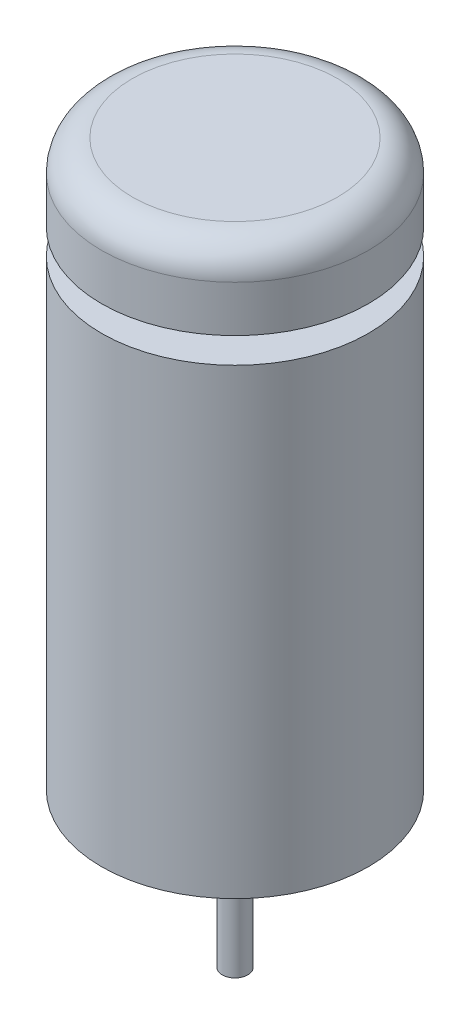
ISO-10303-21;
HEADER;
FILE_DESCRIPTION(('STEP AP214'),'2;1');
FILE_NAME('part.step','',(''),(''),'','','');
FILE_SCHEMA(('AUTOMOTIVE_DESIGN { 1 0 10303 214 1 1 1 1 }'));
ENDSEC;
DATA;
#1=APPLICATION_CONTEXT('core data for automotive mechanical design processes');
#2=APPLICATION_PROTOCOL_DEFINITION('international standard','automotive_design',2000,#1);
#3=PRODUCT_CONTEXT('',#1,'mechanical');
#4=PRODUCT('Part','Part','',(#3));
#5=PRODUCT_RELATED_PRODUCT_CATEGORY('part','',(#4));
#6=PRODUCT_DEFINITION_FORMATION('','',#4);
#7=PRODUCT_DEFINITION_CONTEXT('part definition',#1,'design');
#8=PRODUCT_DEFINITION('design','',#6,#7);
#9=PRODUCT_DEFINITION_SHAPE('','',#8);
#10=(LENGTH_UNIT() NAMED_UNIT(*) SI_UNIT(.MILLI.,.METRE.));
#11=(NAMED_UNIT(*) PLANE_ANGLE_UNIT() SI_UNIT($,.RADIAN.));
#12=(NAMED_UNIT(*) SI_UNIT($,.STERADIAN.) SOLID_ANGLE_UNIT());
#13=UNCERTAINTY_MEASURE_WITH_UNIT(LENGTH_MEASURE(1.E-05),#10,'distance_accuracy_value','');
#14=(GEOMETRIC_REPRESENTATION_CONTEXT(3) GLOBAL_UNCERTAINTY_ASSIGNED_CONTEXT((#13)) GLOBAL_UNIT_ASSIGNED_CONTEXT((#10,
#11,#12)) REPRESENTATION_CONTEXT('',''));
#15=CARTESIAN_POINT('',(0.,0.,0.));
#16=DIRECTION('',(0.,0.,1.));
#17=DIRECTION('',(1.,0.,0.));
#18=AXIS2_PLACEMENT_3D('',#15,#16,#17);
#19=CARTESIAN_POINT('',(0.,-5.,0.));
#20=DIRECTION('',(0.,-1.,0.));
#21=DIRECTION('',(0.,0.,-1.));
#22=AXIS2_PLACEMENT_3D('',#19,#20,#21);
#23=PLANE('',#22);
#24=CARTESIAN_POINT('',(0.,-5.,0.));
#25=DIRECTION('',(0.,-1.,0.));
#26=DIRECTION('',(0.,0.,-1.));
#27=AXIS2_PLACEMENT_3D('',#24,#25,#26);
#28=CIRCLE('',#27,10.6747399595116);
#29=CARTESIAN_POINT('',(0.,-5.,-10.6747399595116));
#30=VERTEX_POINT('',#29);
#31=EDGE_CURVE('E63',#30,#30,#28,.T.);
#32=ORIENTED_EDGE('',*,*,#31,.T.);
#33=EDGE_LOOP('',(#32));
#34=FACE_BOUND('',#33,.T.);
#35=CARTESIAN_POINT('',(0.,-5.,0.));
#36=DIRECTION('',(0.,-1.,0.));
#37=DIRECTION('',(0.,0.,-1.));
#38=AXIS2_PLACEMENT_3D('',#35,#36,#37);
#39=CIRCLE('',#38,2.5);
#40=CARTESIAN_POINT('',(0.,-5.,-2.5));
#41=VERTEX_POINT('',#40);
#42=EDGE_CURVE('E67',#41,#41,#39,.T.);
#43=ORIENTED_EDGE('',*,*,#42,.F.);
#44=EDGE_LOOP('',(#43));
#45=FACE_BOUND('',#44,.T.);
#46=ADVANCED_FACE('F31',(#34,#45),#23,.T.);
#47=CARTESIAN_POINT('',(0.,0.,0.));
#48=DIRECTION('',(0.,1.,0.));
#49=DIRECTION('',(0.,0.,1.));
#50=AXIS2_PLACEMENT_3D('',#47,#48,#49);
#51=PLANE('',#50);
#52=CARTESIAN_POINT('',(0.,0.,0.));
#53=DIRECTION('',(0.,1.,0.));
#54=DIRECTION('',(0.,0.,1.));
#55=AXIS2_PLACEMENT_3D('',#52,#53,#54);
#56=CIRCLE('',#55,26.);
#57=CARTESIAN_POINT('',(0.,0.,-26.));
#58=VERTEX_POINT('',#57);
#59=EDGE_CURVE('E49',#58,#58,#56,.T.);
#60=ORIENTED_EDGE('',*,*,#59,.F.);
#61=EDGE_LOOP('',(#60));
#62=FACE_BOUND('',#61,.T.);
#63=CARTESIAN_POINT('',(0.,0.,0.));
#64=DIRECTION('',(0.,1.,0.));
#65=DIRECTION('',(0.,0.,1.));
#66=AXIS2_PLACEMENT_3D('',#63,#64,#65);
#67=CIRCLE('',#66,10.6747399595116);
#68=CARTESIAN_POINT('',(0.,0.,10.6747399595116));
#69=VERTEX_POINT('',#68);
#70=EDGE_CURVE('E42',#69,#69,#67,.F.);
#71=ORIENTED_EDGE('',*,*,#70,.F.);
#72=EDGE_LOOP('',(#71));
#73=FACE_BOUND('',#72,.T.);
#74=ADVANCED_FACE('F83',(#62,#73),#51,.F.);
#75=CARTESIAN_POINT('',(0.,90.,0.));
#76=DIRECTION('',(0.,1.,0.));
#77=DIRECTION('',(0.,0.,1.));
#78=AXIS2_PLACEMENT_3D('',#75,#76,#77);
#79=PLANE('',#78);
#80=CARTESIAN_POINT('',(0.,90.,0.));
#81=DIRECTION('',(0.,1.,0.));
#82=DIRECTION('',(0.,0.,1.));
#83=AXIS2_PLACEMENT_3D('',#80,#81,#82);
#84=CIRCLE('',#83,26.);
#85=CARTESIAN_POINT('',(0.,90.,-26.));
#86=VERTEX_POINT('',#85);
#87=EDGE_CURVE('E46',#86,#86,#84,.T.);
#88=ORIENTED_EDGE('',*,*,#87,.T.);
#89=EDGE_LOOP('',(#88));
#90=FACE_BOUND('',#89,.T.);
#91=CARTESIAN_POINT('',(0.,90.,0.));
#92=DIRECTION('',(0.,1.,0.));
#93=DIRECTION('',(0.,0.,1.));
#94=AXIS2_PLACEMENT_3D('',#91,#92,#93);
#95=CIRCLE('',#94,8.63864624744792);
#96=CARTESIAN_POINT('',(0.,90.,8.63864624744792));
#97=VERTEX_POINT('',#96);
#98=EDGE_CURVE('E55',#97,#97,#95,.T.);
#99=ORIENTED_EDGE('',*,*,#98,.F.);
#100=EDGE_LOOP('',(#99));
#101=FACE_BOUND('',#100,.T.);
#102=ADVANCED_FACE('F89',(#90,#101),#79,.T.);
#103=CARTESIAN_POINT('',(0.,90.,0.));
#104=DIRECTION('',(0.,-1.,0.));
#105=DIRECTION('',(0.,0.,-1.));
#106=AXIS2_PLACEMENT_3D('',#103,#104,#105);
#107=CYLINDRICAL_SURFACE('',#106,26.);
#108=CARTESIAN_POINT('',(0.,90.,-26.));
#109=CARTESIAN_POINT('',(0.,89.0625,-26.));
#110=CARTESIAN_POINT('',(0.,88.125,-26.));
#111=CARTESIAN_POINT('',(0.,86.25,-26.));
#112=CARTESIAN_POINT('',(0.,85.3125,-26.));
#113=CARTESIAN_POINT('',(0.,83.4375,-26.));
#114=CARTESIAN_POINT('',(0.,82.5,-26.));
#115=CARTESIAN_POINT('',(0.,80.625,-26.));
#116=CARTESIAN_POINT('',(0.,79.6875,-26.));
#117=CARTESIAN_POINT('',(0.,77.8125,-26.));
#118=CARTESIAN_POINT('',(0.,76.875,-26.));
#119=CARTESIAN_POINT('',(0.,75.,-26.));
#120=CARTESIAN_POINT('',(0.,74.0625,-26.));
#121=CARTESIAN_POINT('',(0.,72.1875,-26.));
#122=CARTESIAN_POINT('',(0.,71.25,-26.));
#123=CARTESIAN_POINT('',(0.,69.375,-26.));
#124=CARTESIAN_POINT('',(0.,68.4375,-26.));
#125=CARTESIAN_POINT('',(0.,66.5625,-26.));
#126=CARTESIAN_POINT('',(0.,65.625,-26.));
#127=CARTESIAN_POINT('',(0.,63.75,-26.));
#128=CARTESIAN_POINT('',(0.,62.8125,-26.));
#129=CARTESIAN_POINT('',(0.,60.9375,-26.));
#130=CARTESIAN_POINT('',(0.,60.,-26.));
#131=CARTESIAN_POINT('',(0.,58.125,-26.));
#132=CARTESIAN_POINT('',(0.,57.1875,-26.));
#133=CARTESIAN_POINT('',(0.,55.3125,-26.));
#134=CARTESIAN_POINT('',(0.,54.375,-26.));
#135=CARTESIAN_POINT('',(0.,52.5,-26.));
#136=CARTESIAN_POINT('',(0.,51.5625,-26.));
#137=CARTESIAN_POINT('',(0.,49.6875,-26.));
#138=CARTESIAN_POINT('',(0.,48.75,-26.));
#139=CARTESIAN_POINT('',(0.,46.875,-26.));
#140=CARTESIAN_POINT('',(0.,45.9375,-26.));
#141=CARTESIAN_POINT('',(0.,44.0625,-26.));
#142=CARTESIAN_POINT('',(0.,43.125,-26.));
#143=CARTESIAN_POINT('',(0.,41.25,-26.));
#144=CARTESIAN_POINT('',(0.,40.3125,-26.));
#145=CARTESIAN_POINT('',(0.,38.4375,-26.));
#146=CARTESIAN_POINT('',(0.,37.5,-26.));
#147=CARTESIAN_POINT('',(0.,35.625,-26.));
#148=CARTESIAN_POINT('',(0.,34.6875,-26.));
#149=CARTESIAN_POINT('',(0.,32.8125,-26.));
#150=CARTESIAN_POINT('',(0.,31.875,-26.));
#151=CARTESIAN_POINT('',(0.,30.,-26.));
#152=CARTESIAN_POINT('',(0.,29.0625,-26.));
#153=CARTESIAN_POINT('',(0.,27.1875,-26.));
#154=CARTESIAN_POINT('',(0.,26.25,-26.));
#155=CARTESIAN_POINT('',(0.,24.375,-26.));
#156=CARTESIAN_POINT('',(0.,23.4375,-26.));
#157=CARTESIAN_POINT('',(0.,21.5625,-26.));
#158=CARTESIAN_POINT('',(0.,20.625,-26.));
#159=CARTESIAN_POINT('',(0.,18.75,-26.));
#160=CARTESIAN_POINT('',(0.,17.8125,-26.));
#161=CARTESIAN_POINT('',(0.,15.9375,-26.));
#162=CARTESIAN_POINT('',(0.,15.,-26.));
#163=CARTESIAN_POINT('',(0.,13.125,-26.));
#164=CARTESIAN_POINT('',(0.,12.1875,-26.));
#165=CARTESIAN_POINT('',(0.,10.3125,-26.));
#166=CARTESIAN_POINT('',(0.,9.37499999999999,-26.));
#167=CARTESIAN_POINT('',(0.,7.49999999999999,-26.));
#168=CARTESIAN_POINT('',(0.,6.56249999999999,-26.));
#169=CARTESIAN_POINT('',(0.,4.68749999999999,-26.));
#170=CARTESIAN_POINT('',(0.,3.74999999999998,-26.));
#171=CARTESIAN_POINT('',(0.,1.87499999999998,-26.));
#172=CARTESIAN_POINT('',(0.,0.937499999999986,-26.));
#173=CARTESIAN_POINT('',(0.,0.,-26.));
#174=B_SPLINE_CURVE_WITH_KNOTS('',3,(#108,#109,#110,#111,#112,#113,#114,#115,#116,#117,#118,
#119,#120,#121,#122,#123,#124,#125,#126,#127,#128,#129,#130,#131,#132,#133,#134,#135,#136,#137,
#138,#139,#140,#141,#142,#143,#144,#145,#146,#147,#148,#149,#150,#151,#152,#153,#154,#155,#156,
#157,#158,#159,#160,#161,#162,#163,#164,#165,#166,#167,#168,#169,#170,#171,#172,#173),
.UNSPECIFIED.,.F.,.F.,(4,2,2,2,2,2,2,2,2,2,2,2,2,2,2,2,2,2,2,2,2,2,2,2,2,2,2,2,2,2,2,2,4),(0.,
2.81250000000001,5.62500000000001,8.43750000000001,11.25,14.0625,16.875,19.6875,22.5,25.3125,
28.125,30.9375,33.75,36.5625,39.375,42.1875,45.,47.8125,50.625,53.4375,56.25,59.0625,61.875,
64.6875,67.5,70.3125,73.125,75.9375,78.75,81.5625,84.375,87.1875,90.),.UNSPECIFIED.);
#175=EDGE_CURVE('BSEAM110',#86,#58,#174,.T.);
#176=ORIENTED_EDGE('',*,*,#87,.F.);
#177=ORIENTED_EDGE('',*,*,#59,.T.);
#178=ORIENTED_EDGE('',*,*,#175,.T.);
#179=ORIENTED_EDGE('',*,*,#175,.F.);
#180=EDGE_LOOP('',(#176,#178,#177,#179));
#181=FACE_BOUND('',#180,.T.);
#182=ADVANCED_FACE('F110',(#181),#107,.T.);
#183=CARTESIAN_POINT('',(0.,95.,0.));
#184=DIRECTION('',(0.,-1.,0.));
#185=DIRECTION('',(0.,0.,-1.));
#186=AXIS2_PLACEMENT_3D('',#183,#184,#185);
#187=CYLINDRICAL_SURFACE('',#186,8.63864624744792);
#188=CARTESIAN_POINT('',(0.,95.,0.));
#189=DIRECTION('',(0.,1.,0.));
#190=DIRECTION('',(0.,0.,1.));
#191=AXIS2_PLACEMENT_3D('',#188,#189,#190);
#192=CIRCLE('',#191,8.63864624744792);
#193=CARTESIAN_POINT('',(0.,95.,8.63864624744792));
#194=VERTEX_POINT('',#193);
#195=EDGE_CURVE('E52',#194,#194,#192,.T.);
#196=ORIENTED_EDGE('',*,*,#195,.F.);
#197=EDGE_LOOP('',(#196));
#198=FACE_BOUND('',#197,.T.);
#199=ORIENTED_EDGE('',*,*,#98,.T.);
#200=EDGE_LOOP('',(#199));
#201=FACE_BOUND('',#200,.T.);
#202=ADVANCED_FACE('F104',(#198,#201),#187,.T.);
#203=CARTESIAN_POINT('',(0.,95.,0.));
#204=DIRECTION('',(0.,1.,0.));
#205=DIRECTION('',(0.,0.,1.));
#206=AXIS2_PLACEMENT_3D('',#203,#204,#205);
#207=PLANE('',#206);
#208=CARTESIAN_POINT('',(0.,95.,0.));
#209=DIRECTION('',(0.,1.,0.));
#210=DIRECTION('',(0.,0.,1.));
#211=AXIS2_PLACEMENT_3D('',#208,#209,#210);
#212=CIRCLE('',#211,26.);
#213=CARTESIAN_POINT('',(0.,95.,26.));
#214=VERTEX_POINT('',#213);
#215=EDGE_CURVE('E58',#214,#214,#212,.T.);
#216=ORIENTED_EDGE('',*,*,#215,.F.);
#217=EDGE_LOOP('',(#216));
#218=FACE_BOUND('',#217,.T.);
#219=ORIENTED_EDGE('',*,*,#195,.T.);
#220=EDGE_LOOP('',(#219));
#221=FACE_BOUND('',#220,.T.);
#222=ADVANCED_FACE('F101',(#218,#221),#207,.F.);
#223=CARTESIAN_POINT('',(0.,110.,0.));
#224=DIRECTION('',(0.,-1.,0.));
#225=DIRECTION('',(0.,0.,-1.));
#226=AXIS2_PLACEMENT_3D('',#223,#224,#225);
#227=CYLINDRICAL_SURFACE('',#226,26.);
#228=CARTESIAN_POINT('',(0.,104.,0.));
#229=DIRECTION('',(0.,1.,0.));
#230=DIRECTION('',(0.,0.,1.));
#231=AXIS2_PLACEMENT_3D('',#228,#229,#230);
#232=CIRCLE('',#231,26.);
#233=CARTESIAN_POINT('',(0.,104.,26.));
#234=VERTEX_POINT('',#233);
#235=EDGE_CURVE('E10',#234,#234,#232,.F.);
#236=ORIENTED_EDGE('',*,*,#235,.T.);
#237=EDGE_LOOP('',(#236));
#238=FACE_BOUND('',#237,.T.);
#239=ORIENTED_EDGE('',*,*,#215,.T.);
#240=EDGE_LOOP('',(#239));
#241=FACE_BOUND('',#240,.T.);
#242=ADVANCED_FACE('F100',(#238,#241),#227,.T.);
#243=CARTESIAN_POINT('',(0.,110.,0.));
#244=DIRECTION('',(0.,1.,0.));
#245=DIRECTION('',(0.,0.,1.));
#246=AXIS2_PLACEMENT_3D('',#243,#244,#245);
#247=PLANE('',#246);
#248=CARTESIAN_POINT('',(0.,110.,0.));
#249=DIRECTION('',(0.,1.,0.));
#250=DIRECTION('',(0.,0.,1.));
#251=AXIS2_PLACEMENT_3D('',#248,#249,#250);
#252=CIRCLE('',#251,20.);
#253=CARTESIAN_POINT('',(0.,110.,20.));
#254=VERTEX_POINT('',#253);
#255=EDGE_CURVE('E38',#254,#254,#252,.T.);
#256=ORIENTED_EDGE('',*,*,#255,.T.);
#257=EDGE_LOOP('',(#256));
#258=FACE_BOUND('',#257,.T.);
#259=ADVANCED_FACE('F96',(#258),#247,.T.);
#260=CARTESIAN_POINT('',(0.,-5.,0.));
#261=DIRECTION('',(0.,1.,0.));
#262=DIRECTION('',(0.,0.,1.));
#263=AXIS2_PLACEMENT_3D('',#260,#261,#262);
#264=CYLINDRICAL_SURFACE('',#263,10.6747399595116);
#265=ORIENTED_EDGE('',*,*,#31,.F.);
#266=EDGE_LOOP('',(#265));
#267=FACE_BOUND('',#266,.T.);
#268=ORIENTED_EDGE('',*,*,#70,.T.);
#269=EDGE_LOOP('',(#268));
#270=FACE_BOUND('',#269,.T.);
#271=ADVANCED_FACE('F78',(#267,#270),#264,.T.);
#272=CARTESIAN_POINT('',(0.,-30.,0.));
#273=DIRECTION('',(0.,1.,0.));
#274=DIRECTION('',(0.,0.,1.));
#275=AXIS2_PLACEMENT_3D('',#272,#273,#274);
#276=CYLINDRICAL_SURFACE('',#275,2.5);
#277=CARTESIAN_POINT('',(0.,-30.,0.));
#278=DIRECTION('',(0.,-1.,0.));
#279=DIRECTION('',(0.,0.,-1.));
#280=AXIS2_PLACEMENT_3D('',#277,#278,#279);
#281=CIRCLE('',#280,2.5);
#282=CARTESIAN_POINT('',(0.,-30.,-2.5));
#283=VERTEX_POINT('',#282);
#284=EDGE_CURVE('E66',#283,#283,#281,.T.);
#285=ORIENTED_EDGE('',*,*,#284,.F.);
#286=EDGE_LOOP('',(#285));
#287=FACE_BOUND('',#286,.T.);
#288=ORIENTED_EDGE('',*,*,#42,.T.);
#289=EDGE_LOOP('',(#288));
#290=FACE_BOUND('',#289,.T.);
#291=ADVANCED_FACE('F75',(#287,#290),#276,.T.);
#292=CARTESIAN_POINT('',(0.,-30.,0.));
#293=DIRECTION('',(0.,-1.,0.));
#294=DIRECTION('',(0.,0.,-1.));
#295=AXIS2_PLACEMENT_3D('',#292,#293,#294);
#296=PLANE('',#295);
#297=ORIENTED_EDGE('',*,*,#284,.T.);
#298=EDGE_LOOP('',(#297));
#299=FACE_BOUND('',#298,.T.);
#300=ADVANCED_FACE('F73',(#299),#296,.T.);
#301=CARTESIAN_POINT('',(0.,104.,0.));
#302=DIRECTION('',(0.,1.,0.));
#303=DIRECTION('',(0.,0.,1.));
#304=AXIS2_PLACEMENT_3D('',#301,#302,#303);
#305=TOROIDAL_SURFACE('',#304,20.,6.);
#306=ORIENTED_EDGE('',*,*,#235,.F.);
#307=EDGE_LOOP('',(#306));
#308=FACE_BOUND('',#307,.T.);
#309=ORIENTED_EDGE('',*,*,#255,.F.);
#310=EDGE_LOOP('',(#309));
#311=FACE_BOUND('',#310,.T.);
#312=ADVANCED_FACE('F33',(#308,#311),#305,.T.);
#313=CLOSED_SHELL('',(#46,#74,#102,#182,#202,#222,#242,#259,#271,#291,#300,#312));
#314=MANIFOLD_SOLID_BREP('B2',#313);
#315=ADVANCED_BREP_SHAPE_REPRESENTATION('',(#18,#314),#14);
#316=SHAPE_DEFINITION_REPRESENTATION(#9,#315);
ENDSEC;
END-ISO-10303-21;
